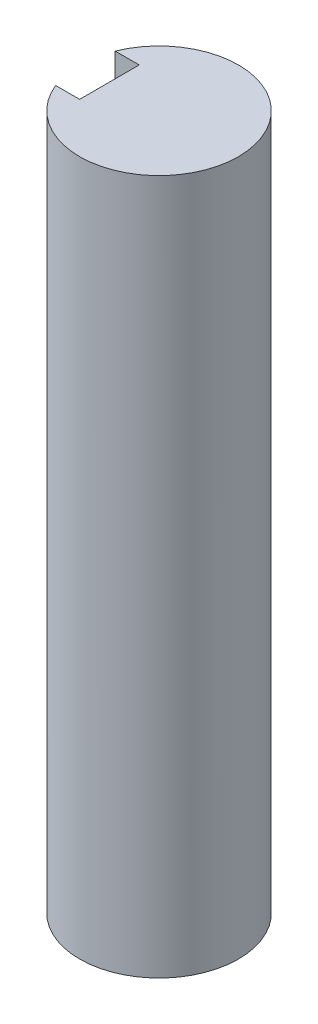
ISO-10303-21;
HEADER;
FILE_DESCRIPTION(('STEP AP214'),'2;1');
FILE_NAME('part.step','',(''),(''),'','','');
FILE_SCHEMA(('AUTOMOTIVE_DESIGN { 1 0 10303 214 1 1 1 1 }'));
ENDSEC;
DATA;
#1=APPLICATION_CONTEXT('core data for automotive mechanical design processes');
#2=APPLICATION_PROTOCOL_DEFINITION('international standard','automotive_design',2000,#1);
#3=PRODUCT_CONTEXT('',#1,'mechanical');
#4=PRODUCT('Part','Part','',(#3));
#5=PRODUCT_RELATED_PRODUCT_CATEGORY('part','',(#4));
#6=PRODUCT_DEFINITION_FORMATION('','',#4);
#7=PRODUCT_DEFINITION_CONTEXT('part definition',#1,'design');
#8=PRODUCT_DEFINITION('design','',#6,#7);
#9=PRODUCT_DEFINITION_SHAPE('','',#8);
#10=(LENGTH_UNIT() NAMED_UNIT(*) SI_UNIT(.MILLI.,.METRE.));
#11=(NAMED_UNIT(*) PLANE_ANGLE_UNIT() SI_UNIT($,.RADIAN.));
#12=(NAMED_UNIT(*) SI_UNIT($,.STERADIAN.) SOLID_ANGLE_UNIT());
#13=UNCERTAINTY_MEASURE_WITH_UNIT(LENGTH_MEASURE(1.E-05),#10,'distance_accuracy_value','');
#14=(GEOMETRIC_REPRESENTATION_CONTEXT(3) GLOBAL_UNCERTAINTY_ASSIGNED_CONTEXT((#13)) GLOBAL_UNIT_ASSIGNED_CONTEXT((#10,
#11,#12)) REPRESENTATION_CONTEXT('',''));
#15=CARTESIAN_POINT('',(0.,0.,0.));
#16=DIRECTION('',(0.,0.,1.));
#17=DIRECTION('',(1.,0.,0.));
#18=AXIS2_PLACEMENT_3D('',#15,#16,#17);
#19=CARTESIAN_POINT('',(-1.5,22.,2.));
#20=DIRECTION('',(0.,0.,1.));
#21=DIRECTION('',(1.,0.,0.));
#22=AXIS2_PLACEMENT_3D('',#19,#20,#21);
#23=PLANE('',#22);
#24=DIRECTION('',(1.,0.,0.));
#25=VECTOR('',#24,1.);
#26=CARTESIAN_POINT('',(-1.5,4.,2.));
#27=LINE('',#26,#25);
#28=CARTESIAN_POINT('',(-1.5,4.,2.));
#29=VERTEX_POINT('',#28);
#30=CARTESIAN_POINT('',(1.5,4.,2.));
#31=VERTEX_POINT('',#30);
#32=EDGE_CURVE('E165',#29,#31,#27,.T.);
#33=ORIENTED_EDGE('',*,*,#32,.F.);
#34=DIRECTION('',(0.,-1.,0.));
#35=VECTOR('',#34,1.);
#36=CARTESIAN_POINT('',(-1.5,22.,2.));
#37=LINE('',#36,#35);
#38=CARTESIAN_POINT('',(-1.5,22.,2.));
#39=VERTEX_POINT('',#38);
#40=EDGE_CURVE('E153',#39,#29,#37,.T.);
#41=ORIENTED_EDGE('',*,*,#40,.F.);
#42=DIRECTION('',(-1.,0.,0.));
#43=VECTOR('',#42,1.);
#44=CARTESIAN_POINT('',(-1.5,22.,2.));
#45=LINE('',#44,#43);
#46=CARTESIAN_POINT('',(1.5,22.,2.));
#47=VERTEX_POINT('',#46);
#48=EDGE_CURVE('E145',#47,#39,#45,.T.);
#49=ORIENTED_EDGE('',*,*,#48,.F.);
#50=DIRECTION('',(0.,-1.,0.));
#51=VECTOR('',#50,1.);
#52=CARTESIAN_POINT('',(1.5,22.,2.));
#53=LINE('',#52,#51);
#54=EDGE_CURVE('E149',#47,#31,#53,.T.);
#55=ORIENTED_EDGE('',*,*,#54,.T.);
#56=EDGE_LOOP('',(#33,#41,#49,#55));
#57=FACE_BOUND('',#56,.T.);
#58=ADVANCED_FACE('F45',(#57),#23,.F.);
#59=CARTESIAN_POINT('',(0.,35.,0.));
#60=DIRECTION('',(0.,-1.,0.));
#61=DIRECTION('',(0.,0.,-1.));
#62=AXIS2_PLACEMENT_3D('',#59,#60,#61);
#63=CYLINDRICAL_SURFACE('',#62,4.);
#64=CARTESIAN_POINT('',(0.,35.,0.));
#65=DIRECTION('',(0.,1.,0.));
#66=DIRECTION('',(0.,0.,1.));
#67=AXIS2_PLACEMENT_3D('',#64,#65,#66);
#68=CIRCLE('',#67,4.);
#69=CARTESIAN_POINT('',(-3.70809924354783,35.,1.5));
#70=VERTEX_POINT('',#69);
#71=CARTESIAN_POINT('',(-3.70809924354783,35.,-1.5));
#72=VERTEX_POINT('',#71);
#73=EDGE_CURVE('E161',#70,#72,#68,.T.);
#74=ORIENTED_EDGE('',*,*,#73,.F.);
#75=DIRECTION('',(0.,-1.,0.));
#76=VECTOR('',#75,1.);
#77=CARTESIAN_POINT('',(-3.70809924354783,35.,1.5));
#78=LINE('',#77,#76);
#79=CARTESIAN_POINT('',(-3.70809924354783,30.,1.5));
#80=VERTEX_POINT('',#79);
#81=EDGE_CURVE('E134',#70,#80,#78,.T.);
#82=ORIENTED_EDGE('',*,*,#81,.T.);
#83=CARTESIAN_POINT('',(0.,30.,0.));
#84=DIRECTION('',(0.,1.,0.));
#85=DIRECTION('',(0.,0.,1.));
#86=AXIS2_PLACEMENT_3D('',#83,#84,#85);
#87=CIRCLE('',#86,4.);
#88=CARTESIAN_POINT('',(-3.70809924354783,30.,-1.5));
#89=VERTEX_POINT('',#88);
#90=EDGE_CURVE('E11',#89,#80,#87,.T.);
#91=ORIENTED_EDGE('',*,*,#90,.F.);
#92=DIRECTION('',(0.,-1.,0.));
#93=VECTOR('',#92,1.);
#94=CARTESIAN_POINT('',(-3.70809924354783,35.,-1.5));
#95=LINE('',#94,#93);
#96=EDGE_CURVE('E112',#89,#72,#95,.F.);
#97=ORIENTED_EDGE('',*,*,#96,.T.);
#98=EDGE_LOOP('',(#74,#82,#91,#97));
#99=FACE_BOUND('',#98,.T.);
#100=CARTESIAN_POINT('',(0.,0.,0.));
#101=DIRECTION('',(0.,1.,0.));
#102=DIRECTION('',(0.,0.,1.));
#103=AXIS2_PLACEMENT_3D('',#100,#101,#102);
#104=CIRCLE('',#103,4.);
#105=CARTESIAN_POINT('',(0.,0.,4.));
#106=VERTEX_POINT('',#105);
#107=EDGE_CURVE('E157',#106,#106,#104,.T.);
#108=ORIENTED_EDGE('',*,*,#107,.T.);
#109=EDGE_LOOP('',(#108));
#110=FACE_BOUND('',#109,.T.);
#111=ADVANCED_FACE('F47',(#99,#110),#63,.T.);
#112=CARTESIAN_POINT('',(0.,35.,0.));
#113=DIRECTION('',(0.,1.,0.));
#114=DIRECTION('',(0.,0.,1.));
#115=AXIS2_PLACEMENT_3D('',#112,#113,#114);
#116=PLANE('',#115);
#117=DIRECTION('',(1.,0.,0.));
#118=VECTOR('',#117,1.);
#119=CARTESIAN_POINT('',(0.,35.,1.5));
#120=LINE('',#119,#118);
#121=CARTESIAN_POINT('',(-2.5,35.,1.5));
#122=VERTEX_POINT('',#121);
#123=EDGE_CURVE('E54',#70,#122,#120,.T.);
#124=ORIENTED_EDGE('',*,*,#123,.F.);
#125=ORIENTED_EDGE('',*,*,#73,.T.);
#126=DIRECTION('',(-1.,0.,0.));
#127=VECTOR('',#126,1.);
#128=CARTESIAN_POINT('',(-5.5,35.,-1.5));
#129=LINE('',#128,#127);
#130=CARTESIAN_POINT('',(-2.5,35.,-1.5));
#131=VERTEX_POINT('',#130);
#132=EDGE_CURVE('E121',#131,#72,#129,.T.);
#133=ORIENTED_EDGE('',*,*,#132,.F.);
#134=DIRECTION('',(0.,0.,-1.));
#135=VECTOR('',#134,1.);
#136=CARTESIAN_POINT('',(-2.5,35.,-1.5));
#137=LINE('',#136,#135);
#138=EDGE_CURVE('E61',#122,#131,#137,.T.);
#139=ORIENTED_EDGE('',*,*,#138,.F.);
#140=EDGE_LOOP('',(#124,#125,#133,#139));
#141=FACE_BOUND('',#140,.T.);
#142=ADVANCED_FACE('F176',(#141),#116,.T.);
#143=CARTESIAN_POINT('',(0.,0.,0.));
#144=DIRECTION('',(0.,1.,0.));
#145=DIRECTION('',(0.,0.,1.));
#146=AXIS2_PLACEMENT_3D('',#143,#144,#145);
#147=PLANE('',#146);
#148=CARTESIAN_POINT('',(0.,0.,0.));
#149=DIRECTION('',(0.,-1.,0.));
#150=DIRECTION('',(0.,0.,-1.));
#151=AXIS2_PLACEMENT_3D('',#148,#149,#150);
#152=CIRCLE('',#151,2.5);
#153=CARTESIAN_POINT('',(0.,0.,-2.5));
#154=VERTEX_POINT('',#153);
#155=EDGE_CURVE('E140',#154,#154,#152,.T.);
#156=ORIENTED_EDGE('',*,*,#155,.F.);
#157=EDGE_LOOP('',(#156));
#158=FACE_BOUND('',#157,.T.);
#159=ORIENTED_EDGE('',*,*,#107,.F.);
#160=EDGE_LOOP('',(#159));
#161=FACE_BOUND('',#160,.T.);
#162=ADVANCED_FACE('F182',(#158,#161),#147,.F.);
#163=CARTESIAN_POINT('',(0.,22.,0.));
#164=DIRECTION('',(0.,-1.,0.));
#165=DIRECTION('',(0.,0.,-1.));
#166=AXIS2_PLACEMENT_3D('',#163,#164,#165);
#167=CYLINDRICAL_SURFACE('',#166,2.5);
#168=ORIENTED_EDGE('',*,*,#155,.T.);
#169=EDGE_LOOP('',(#168));
#170=FACE_BOUND('',#169,.T.);
#171=CARTESIAN_POINT('',(0.,4.,0.));
#172=DIRECTION('',(0.,-1.,0.));
#173=DIRECTION('',(0.,0.,-1.));
#174=AXIS2_PLACEMENT_3D('',#171,#172,#173);
#175=CIRCLE('',#174,2.5);
#176=EDGE_CURVE('E68',#31,#29,#175,.T.);
#177=ORIENTED_EDGE('',*,*,#176,.F.);
#178=ORIENTED_EDGE('',*,*,#54,.F.);
#179=CARTESIAN_POINT('',(0.,22.,0.));
#180=DIRECTION('',(0.,-1.,0.));
#181=DIRECTION('',(0.,0.,-1.));
#182=AXIS2_PLACEMENT_3D('',#179,#180,#181);
#183=CIRCLE('',#182,2.5);
#184=EDGE_CURVE('E141',#39,#47,#183,.T.);
#185=ORIENTED_EDGE('',*,*,#184,.F.);
#186=ORIENTED_EDGE('',*,*,#40,.T.);
#187=EDGE_LOOP('',(#177,#178,#185,#186));
#188=FACE_BOUND('',#187,.T.);
#189=ADVANCED_FACE('F184',(#170,#188),#167,.F.);
#190=CARTESIAN_POINT('',(0.,22.,0.));
#191=DIRECTION('',(0.,-1.,0.));
#192=DIRECTION('',(0.,0.,-1.));
#193=AXIS2_PLACEMENT_3D('',#190,#191,#192);
#194=PLANE('',#193);
#195=ORIENTED_EDGE('',*,*,#184,.T.);
#196=ORIENTED_EDGE('',*,*,#48,.T.);
#197=EDGE_LOOP('',(#195,#196));
#198=FACE_BOUND('',#197,.T.);
#199=ADVANCED_FACE('F190',(#198),#194,.T.);
#200=CARTESIAN_POINT('',(0.,4.,0.));
#201=DIRECTION('',(0.,-1.,0.));
#202=DIRECTION('',(0.,0.,-1.));
#203=AXIS2_PLACEMENT_3D('',#200,#201,#202);
#204=PLANE('',#203);
#205=ORIENTED_EDGE('',*,*,#32,.T.);
#206=ORIENTED_EDGE('',*,*,#176,.T.);
#207=EDGE_LOOP('',(#205,#206));
#208=FACE_BOUND('',#207,.T.);
#209=ADVANCED_FACE('F203',(#208),#204,.T.);
#210=CARTESIAN_POINT('',(0.,30.,0.));
#211=DIRECTION('',(0.,1.,0.));
#212=DIRECTION('',(0.,0.,1.));
#213=AXIS2_PLACEMENT_3D('',#210,#211,#212);
#214=PLANE('',#213);
#215=ORIENTED_EDGE('',*,*,#90,.T.);
#216=DIRECTION('',(1.,0.,0.));
#217=VECTOR('',#216,1.);
#218=CARTESIAN_POINT('',(-5.5,30.,1.5));
#219=LINE('',#218,#217);
#220=CARTESIAN_POINT('',(-2.5,30.,1.5));
#221=VERTEX_POINT('',#220);
#222=EDGE_CURVE('E106',#80,#221,#219,.T.);
#223=ORIENTED_EDGE('',*,*,#222,.T.);
#224=DIRECTION('',(0.,0.,-1.));
#225=VECTOR('',#224,1.);
#226=CARTESIAN_POINT('',(-2.5,30.,-1.5));
#227=LINE('',#226,#225);
#228=CARTESIAN_POINT('',(-2.5,30.,-1.5));
#229=VERTEX_POINT('',#228);
#230=EDGE_CURVE('E101',#221,#229,#227,.T.);
#231=ORIENTED_EDGE('',*,*,#230,.T.);
#232=DIRECTION('',(-1.,0.,0.));
#233=VECTOR('',#232,1.);
#234=CARTESIAN_POINT('',(-5.5,30.,-1.5));
#235=LINE('',#234,#233);
#236=EDGE_CURVE('E109',#229,#89,#235,.T.);
#237=ORIENTED_EDGE('',*,*,#236,.T.);
#238=EDGE_LOOP('',(#215,#223,#231,#237));
#239=FACE_BOUND('',#238,.T.);
#240=ADVANCED_FACE('F117',(#239),#214,.T.);
#241=CARTESIAN_POINT('',(-5.5,30.,1.5));
#242=DIRECTION('',(0.,0.,1.));
#243=DIRECTION('',(1.,0.,0.));
#244=AXIS2_PLACEMENT_3D('',#241,#242,#243);
#245=PLANE('',#244);
#246=ORIENTED_EDGE('',*,*,#123,.T.);
#247=DIRECTION('',(0.,1.,0.));
#248=VECTOR('',#247,1.);
#249=CARTESIAN_POINT('',(-2.5,30.,1.5));
#250=LINE('',#249,#248);
#251=EDGE_CURVE('E105',#221,#122,#250,.T.);
#252=ORIENTED_EDGE('',*,*,#251,.F.);
#253=ORIENTED_EDGE('',*,*,#222,.F.);
#254=ORIENTED_EDGE('',*,*,#81,.F.);
#255=EDGE_LOOP('',(#246,#252,#253,#254));
#256=FACE_BOUND('',#255,.T.);
#257=ADVANCED_FACE('F173',(#256),#245,.F.);
#258=CARTESIAN_POINT('',(-5.5,30.,-1.5));
#259=DIRECTION('',(0.,0.,-1.));
#260=DIRECTION('',(-1.,0.,0.));
#261=AXIS2_PLACEMENT_3D('',#258,#259,#260);
#262=PLANE('',#261);
#263=ORIENTED_EDGE('',*,*,#236,.F.);
#264=DIRECTION('',(0.,1.,0.));
#265=VECTOR('',#264,1.);
#266=CARTESIAN_POINT('',(-2.5,30.,-1.5));
#267=LINE('',#266,#265);
#268=EDGE_CURVE('E97',#229,#131,#267,.T.);
#269=ORIENTED_EDGE('',*,*,#268,.T.);
#270=ORIENTED_EDGE('',*,*,#132,.T.);
#271=ORIENTED_EDGE('',*,*,#96,.F.);
#272=EDGE_LOOP('',(#263,#269,#270,#271));
#273=FACE_BOUND('',#272,.T.);
#274=ADVANCED_FACE('F110',(#273),#262,.F.);
#275=CARTESIAN_POINT('',(-2.5,30.,-1.5));
#276=DIRECTION('',(1.,0.,0.));
#277=DIRECTION('',(0.,0.,-1.));
#278=AXIS2_PLACEMENT_3D('',#275,#276,#277);
#279=PLANE('',#278);
#280=ORIENTED_EDGE('',*,*,#138,.T.);
#281=ORIENTED_EDGE('',*,*,#268,.F.);
#282=ORIENTED_EDGE('',*,*,#230,.F.);
#283=ORIENTED_EDGE('',*,*,#251,.T.);
#284=EDGE_LOOP('',(#280,#281,#282,#283));
#285=FACE_BOUND('',#284,.T.);
#286=ADVANCED_FACE('F99',(#285),#279,.F.);
#287=CLOSED_SHELL('',(#58,#111,#142,#162,#189,#199,#209,#240,#257,#274,#286));
#288=MANIFOLD_SOLID_BREP('B2',#287);
#289=ADVANCED_BREP_SHAPE_REPRESENTATION('',(#18,#288),#14);
#290=SHAPE_DEFINITION_REPRESENTATION(#9,#289);
ENDSEC;
END-ISO-10303-21;
